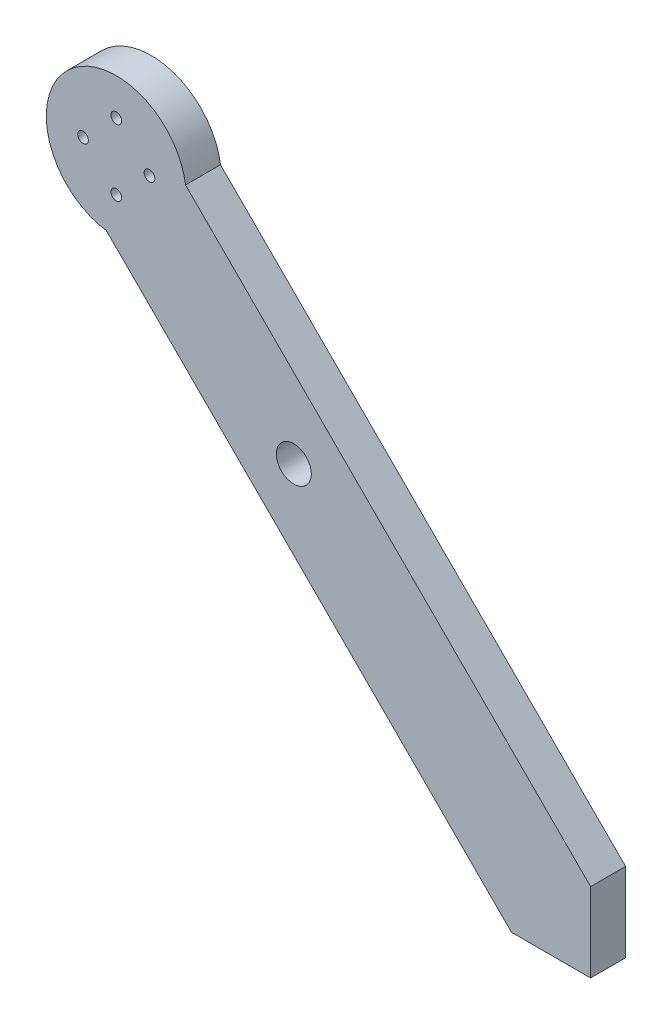
ISO-10303-21;
HEADER;
FILE_DESCRIPTION(('STEP AP214'),'2;1');
FILE_NAME('part.step','',(''),(''),'','','');
FILE_SCHEMA(('AUTOMOTIVE_DESIGN { 1 0 10303 214 1 1 1 1 }'));
ENDSEC;
DATA;
#1=APPLICATION_CONTEXT('core data for automotive mechanical design processes');
#2=APPLICATION_PROTOCOL_DEFINITION('international standard','automotive_design',2000,#1);
#3=PRODUCT_CONTEXT('',#1,'mechanical');
#4=PRODUCT('Part','Part','',(#3));
#5=PRODUCT_RELATED_PRODUCT_CATEGORY('part','',(#4));
#6=PRODUCT_DEFINITION_FORMATION('','',#4);
#7=PRODUCT_DEFINITION_CONTEXT('part definition',#1,'design');
#8=PRODUCT_DEFINITION('design','',#6,#7);
#9=PRODUCT_DEFINITION_SHAPE('','',#8);
#10=(LENGTH_UNIT() NAMED_UNIT(*) SI_UNIT(.MILLI.,.METRE.));
#11=(NAMED_UNIT(*) PLANE_ANGLE_UNIT() SI_UNIT($,.RADIAN.));
#12=(NAMED_UNIT(*) SI_UNIT($,.STERADIAN.) SOLID_ANGLE_UNIT());
#13=UNCERTAINTY_MEASURE_WITH_UNIT(LENGTH_MEASURE(1.E-05),#10,'distance_accuracy_value','');
#14=(GEOMETRIC_REPRESENTATION_CONTEXT(3) GLOBAL_UNCERTAINTY_ASSIGNED_CONTEXT((#13)) GLOBAL_UNIT_ASSIGNED_CONTEXT((#10,
#11,#12)) REPRESENTATION_CONTEXT('',''));
#15=CARTESIAN_POINT('',(0.,0.,0.));
#16=DIRECTION('',(0.,0.,1.));
#17=DIRECTION('',(1.,0.,0.));
#18=AXIS2_PLACEMENT_3D('',#15,#16,#17);
#19=CARTESIAN_POINT('',(-135.610173055266,135.610173055266,10.));
#20=DIRECTION('',(0.,0.,-1.));
#21=DIRECTION('',(-1.,0.,0.));
#22=AXIS2_PLACEMENT_3D('',#19,#20,#21);
#23=CYLINDRICAL_SURFACE('',#22,20.);
#24=CARTESIAN_POINT('',(-135.610173055266,135.610173055266,0.));
#25=DIRECTION('',(0.,0.,1.));
#26=DIRECTION('',(1.,0.,0.));
#27=AXIS2_PLACEMENT_3D('',#24,#25,#26);
#28=CIRCLE('',#27,20.);
#29=CARTESIAN_POINT('',(-115.811183182043,138.438600180013,0.));
#30=VERTEX_POINT('',#29);
#31=CARTESIAN_POINT('',(-138.438600180013,115.811183182043,0.));
#32=VERTEX_POINT('',#31);
#33=EDGE_CURVE('E112',#30,#32,#28,.T.);
#34=ORIENTED_EDGE('',*,*,#33,.T.);
#35=DIRECTION('',(0.,0.,-1.));
#36=VECTOR('',#35,1.);
#37=CARTESIAN_POINT('',(-138.438600180013,115.811183182043,10.));
#38=LINE('',#37,#36);
#39=CARTESIAN_POINT('',(-138.438600180013,115.811183182043,10.));
#40=VERTEX_POINT('',#39);
#41=EDGE_CURVE('E125',#40,#32,#38,.T.);
#42=ORIENTED_EDGE('',*,*,#41,.F.);
#43=CARTESIAN_POINT('',(-135.610173055266,135.610173055266,10.));
#44=DIRECTION('',(0.,0.,1.));
#45=DIRECTION('',(1.,0.,0.));
#46=AXIS2_PLACEMENT_3D('',#43,#44,#45);
#47=CIRCLE('',#46,20.);
#48=CARTESIAN_POINT('',(-115.811183182043,138.438600180013,10.));
#49=VERTEX_POINT('',#48);
#50=EDGE_CURVE('E121',#49,#40,#47,.T.);
#51=ORIENTED_EDGE('',*,*,#50,.F.);
#52=DIRECTION('',(0.,0.,-1.));
#53=VECTOR('',#52,1.);
#54=CARTESIAN_POINT('',(-115.811183182043,138.438600180013,10.));
#55=LINE('',#54,#53);
#56=EDGE_CURVE('E108',#49,#30,#55,.T.);
#57=ORIENTED_EDGE('',*,*,#56,.T.);
#58=EDGE_LOOP('',(#34,#42,#51,#57));
#59=FACE_BOUND('',#58,.T.);
#60=ADVANCED_FACE('F36',(#59),#23,.T.);
#61=CARTESIAN_POINT('',(-11.3137084989847,-11.3137084989848,10.));
#62=DIRECTION('',(0.707106781186547,0.707106781186548,0.));
#63=DIRECTION('',(-0.707106781186548,0.707106781186547,0.));
#64=AXIS2_PLACEMENT_3D('',#61,#62,#63);
#65=PLANE('',#64);
#66=DIRECTION('',(0.707106781186548,-0.707106781186547,0.));
#67=VECTOR('',#66,1.);
#68=CARTESIAN_POINT('',(-11.3137084989847,-11.3137084989848,0.));
#69=LINE('',#68,#67);
#70=CARTESIAN_POINT('',(-22.6274169979694,0.,0.));
#71=VERTEX_POINT('',#70);
#72=EDGE_CURVE('E115',#32,#71,#69,.T.);
#73=ORIENTED_EDGE('',*,*,#72,.T.);
#74=DIRECTION('',(0.,0.,-1.));
#75=VECTOR('',#74,1.);
#76=CARTESIAN_POINT('',(-22.6274169979694,0.,10.));
#77=LINE('',#76,#75);
#78=CARTESIAN_POINT('',(-22.6274169979694,0.,10.));
#79=VERTEX_POINT('',#78);
#80=EDGE_CURVE('E103',#79,#71,#77,.T.);
#81=ORIENTED_EDGE('',*,*,#80,.F.);
#82=DIRECTION('',(0.707106781186548,-0.707106781186547,0.));
#83=VECTOR('',#82,1.);
#84=CARTESIAN_POINT('',(-11.3137084989847,-11.3137084989848,10.));
#85=LINE('',#84,#83);
#86=EDGE_CURVE('E87',#40,#79,#85,.T.);
#87=ORIENTED_EDGE('',*,*,#86,.F.);
#88=ORIENTED_EDGE('',*,*,#41,.T.);
#89=EDGE_LOOP('',(#73,#81,#87,#88));
#90=FACE_BOUND('',#89,.T.);
#91=ADVANCED_FACE('F151',(#90),#65,.F.);
#92=CARTESIAN_POINT('',(0.,0.,10.));
#93=DIRECTION('',(0.,1.,0.));
#94=DIRECTION('',(-1.,0.,0.));
#95=AXIS2_PLACEMENT_3D('',#92,#93,#94);
#96=PLANE('',#95);
#97=DIRECTION('',(1.,0.,0.));
#98=VECTOR('',#97,1.);
#99=CARTESIAN_POINT('',(0.,0.,0.));
#100=LINE('',#99,#98);
#101=CARTESIAN_POINT('',(0.,0.,0.));
#102=VERTEX_POINT('',#101);
#103=EDGE_CURVE('E102',#71,#102,#100,.T.);
#104=ORIENTED_EDGE('',*,*,#103,.T.);
#105=DIRECTION('',(0.,0.,-1.));
#106=VECTOR('',#105,1.);
#107=CARTESIAN_POINT('',(0.,0.,10.));
#108=LINE('',#107,#106);
#109=CARTESIAN_POINT('',(0.,0.,10.));
#110=VERTEX_POINT('',#109);
#111=EDGE_CURVE('E99',#110,#102,#108,.T.);
#112=ORIENTED_EDGE('',*,*,#111,.F.);
#113=DIRECTION('',(1.,0.,0.));
#114=VECTOR('',#113,1.);
#115=CARTESIAN_POINT('',(0.,0.,10.));
#116=LINE('',#115,#114);
#117=EDGE_CURVE('E91',#79,#110,#116,.T.);
#118=ORIENTED_EDGE('',*,*,#117,.F.);
#119=ORIENTED_EDGE('',*,*,#80,.T.);
#120=EDGE_LOOP('',(#104,#112,#118,#119));
#121=FACE_BOUND('',#120,.T.);
#122=ADVANCED_FACE('F100',(#121),#96,.F.);
#123=CARTESIAN_POINT('',(0.,0.,10.));
#124=DIRECTION('',(-1.,0.,0.));
#125=DIRECTION('',(0.,-1.,0.));
#126=AXIS2_PLACEMENT_3D('',#123,#124,#125);
#127=PLANE('',#126);
#128=DIRECTION('',(0.,1.,0.));
#129=VECTOR('',#128,1.);
#130=CARTESIAN_POINT('',(0.,0.,0.));
#131=LINE('',#130,#129);
#132=CARTESIAN_POINT('',(0.,22.6274169979696,0.));
#133=VERTEX_POINT('',#132);
#134=EDGE_CURVE('E72',#102,#133,#131,.T.);
#135=ORIENTED_EDGE('',*,*,#134,.T.);
#136=DIRECTION('',(0.,0.,-1.));
#137=VECTOR('',#136,1.);
#138=CARTESIAN_POINT('',(0.,22.6274169979696,10.));
#139=LINE('',#138,#137);
#140=CARTESIAN_POINT('',(0.,22.6274169979696,10.));
#141=VERTEX_POINT('',#140);
#142=EDGE_CURVE('E104',#141,#133,#139,.T.);
#143=ORIENTED_EDGE('',*,*,#142,.F.);
#144=DIRECTION('',(0.,1.,0.));
#145=VECTOR('',#144,1.);
#146=CARTESIAN_POINT('',(0.,0.,10.));
#147=LINE('',#146,#145);
#148=EDGE_CURVE('E95',#110,#141,#147,.T.);
#149=ORIENTED_EDGE('',*,*,#148,.F.);
#150=ORIENTED_EDGE('',*,*,#111,.T.);
#151=EDGE_LOOP('',(#135,#143,#149,#150));
#152=FACE_BOUND('',#151,.T.);
#153=ADVANCED_FACE('F106',(#152),#127,.F.);
#154=CARTESIAN_POINT('',(11.3137084989848,11.3137084989848,10.));
#155=DIRECTION('',(-0.707106781186547,-0.707106781186548,0.));
#156=DIRECTION('',(0.707106781186548,-0.707106781186547,0.));
#157=AXIS2_PLACEMENT_3D('',#154,#155,#156);
#158=PLANE('',#157);
#159=DIRECTION('',(-0.707106781186548,0.707106781186547,0.));
#160=VECTOR('',#159,1.);
#161=CARTESIAN_POINT('',(11.3137084989848,11.3137084989848,0.));
#162=LINE('',#161,#160);
#163=EDGE_CURVE('E78',#133,#30,#162,.T.);
#164=ORIENTED_EDGE('',*,*,#163,.T.);
#165=ORIENTED_EDGE('',*,*,#56,.F.);
#166=DIRECTION('',(-0.707106781186548,0.707106781186547,0.));
#167=VECTOR('',#166,1.);
#168=CARTESIAN_POINT('',(11.3137084989848,11.3137084989848,10.));
#169=LINE('',#168,#167);
#170=EDGE_CURVE('E52',#141,#49,#169,.T.);
#171=ORIENTED_EDGE('',*,*,#170,.F.);
#172=ORIENTED_EDGE('',*,*,#142,.T.);
#173=EDGE_LOOP('',(#164,#165,#171,#172));
#174=FACE_BOUND('',#173,.T.);
#175=ADVANCED_FACE('F140',(#174),#158,.F.);
#176=CARTESIAN_POINT('',(0.,0.,10.));
#177=DIRECTION('',(0.,0.,1.));
#178=DIRECTION('',(1.,0.,0.));
#179=AXIS2_PLACEMENT_3D('',#176,#177,#178);
#180=PLANE('',#179);
#181=CARTESIAN_POINT('',(-135.610173055266,145.110173055266,10.));
#182=DIRECTION('',(0.,0.,-1.));
#183=DIRECTION('',(-1.,0.,0.));
#184=AXIS2_PLACEMENT_3D('',#181,#182,#183);
#185=CIRCLE('',#184,1.52500000000001);
#186=CARTESIAN_POINT('',(-137.135173055266,145.110173055266,10.));
#187=VERTEX_POINT('',#186);
#188=EDGE_CURVE('E280',#187,#187,#185,.T.);
#189=ORIENTED_EDGE('',*,*,#188,.T.);
#190=EDGE_LOOP('',(#189));
#191=FACE_BOUND('',#190,.T.);
#192=CARTESIAN_POINT('',(-145.110173055267,135.610173055267,10.));
#193=DIRECTION('',(0.,0.,-1.));
#194=DIRECTION('',(-1.,0.,0.));
#195=AXIS2_PLACEMENT_3D('',#192,#193,#194);
#196=CIRCLE('',#195,1.52500000000001);
#197=CARTESIAN_POINT('',(-146.635173055267,135.610173055267,10.));
#198=VERTEX_POINT('',#197);
#199=EDGE_CURVE('E284',#198,#198,#196,.T.);
#200=ORIENTED_EDGE('',*,*,#199,.T.);
#201=EDGE_LOOP('',(#200));
#202=FACE_BOUND('',#201,.T.);
#203=CARTESIAN_POINT('',(-135.610173055266,126.110173055266,10.));
#204=DIRECTION('',(0.,0.,-1.));
#205=DIRECTION('',(-1.,0.,0.));
#206=AXIS2_PLACEMENT_3D('',#203,#204,#205);
#207=CIRCLE('',#206,1.52500000000001);
#208=CARTESIAN_POINT('',(-137.135173055266,126.110173055266,10.));
#209=VERTEX_POINT('',#208);
#210=EDGE_CURVE('E294',#209,#209,#207,.T.);
#211=ORIENTED_EDGE('',*,*,#210,.T.);
#212=EDGE_LOOP('',(#211));
#213=FACE_BOUND('',#212,.T.);
#214=CARTESIAN_POINT('',(-126.110173055266,135.610173055266,10.));
#215=DIRECTION('',(0.,0.,-1.));
#216=DIRECTION('',(-1.,0.,0.));
#217=AXIS2_PLACEMENT_3D('',#214,#215,#216);
#218=CIRCLE('',#217,1.52500000000001);
#219=CARTESIAN_POINT('',(-127.635173055266,135.610173055266,10.));
#220=VERTEX_POINT('',#219);
#221=EDGE_CURVE('E300',#220,#220,#218,.T.);
#222=ORIENTED_EDGE('',*,*,#221,.T.);
#223=EDGE_LOOP('',(#222));
#224=FACE_BOUND('',#223,.T.);
#225=CARTESIAN_POINT('',(-84.8528137423864,84.852813742385,10.));
#226=DIRECTION('',(0.,0.,-1.));
#227=DIRECTION('',(-1.,0.,0.));
#228=AXIS2_PLACEMENT_3D('',#225,#226,#227);
#229=CIRCLE('',#228,4.99999999999986);
#230=CARTESIAN_POINT('',(-89.8528137423863,84.852813742385,10.));
#231=VERTEX_POINT('',#230);
#232=EDGE_CURVE('E306',#231,#231,#229,.T.);
#233=ORIENTED_EDGE('',*,*,#232,.T.);
#234=EDGE_LOOP('',(#233));
#235=FACE_BOUND('',#234,.T.);
#236=ORIENTED_EDGE('',*,*,#50,.T.);
#237=ORIENTED_EDGE('',*,*,#86,.T.);
#238=ORIENTED_EDGE('',*,*,#117,.T.);
#239=ORIENTED_EDGE('',*,*,#148,.T.);
#240=ORIENTED_EDGE('',*,*,#170,.T.);
#241=EDGE_LOOP('',(#236,#237,#238,#239,#240));
#242=FACE_BOUND('',#241,.T.);
#243=ADVANCED_FACE('F93',(#191,#202,#213,#224,#235,#242),#180,.T.);
#244=CARTESIAN_POINT('',(0.,0.,0.));
#245=DIRECTION('',(0.,0.,1.));
#246=DIRECTION('',(1.,0.,0.));
#247=AXIS2_PLACEMENT_3D('',#244,#245,#246);
#248=PLANE('',#247);
#249=CARTESIAN_POINT('',(-135.610173055266,145.110173055266,0.));
#250=DIRECTION('',(0.,0.,-1.));
#251=DIRECTION('',(-1.,0.,0.));
#252=AXIS2_PLACEMENT_3D('',#249,#250,#251);
#253=CIRCLE('',#252,1.52500000000001);
#254=CARTESIAN_POINT('',(-137.135173055266,145.110173055266,0.));
#255=VERTEX_POINT('',#254);
#256=EDGE_CURVE('E283',#255,#255,#253,.T.);
#257=ORIENTED_EDGE('',*,*,#256,.F.);
#258=EDGE_LOOP('',(#257));
#259=FACE_BOUND('',#258,.T.);
#260=CARTESIAN_POINT('',(-145.110173055267,135.610173055267,0.));
#261=DIRECTION('',(0.,0.,-1.));
#262=DIRECTION('',(-1.,0.,0.));
#263=AXIS2_PLACEMENT_3D('',#260,#261,#262);
#264=CIRCLE('',#263,1.52500000000001);
#265=CARTESIAN_POINT('',(-146.635173055267,135.610173055267,0.));
#266=VERTEX_POINT('',#265);
#267=EDGE_CURVE('E289',#266,#266,#264,.T.);
#268=ORIENTED_EDGE('',*,*,#267,.F.);
#269=EDGE_LOOP('',(#268));
#270=FACE_BOUND('',#269,.T.);
#271=CARTESIAN_POINT('',(-135.610173055266,126.110173055266,0.));
#272=DIRECTION('',(0.,0.,-1.));
#273=DIRECTION('',(-1.,0.,0.));
#274=AXIS2_PLACEMENT_3D('',#271,#272,#273);
#275=CIRCLE('',#274,1.52500000000001);
#276=CARTESIAN_POINT('',(-137.135173055266,126.110173055266,0.));
#277=VERTEX_POINT('',#276);
#278=EDGE_CURVE('E297',#277,#277,#275,.T.);
#279=ORIENTED_EDGE('',*,*,#278,.F.);
#280=EDGE_LOOP('',(#279));
#281=FACE_BOUND('',#280,.T.);
#282=CARTESIAN_POINT('',(-126.110173055266,135.610173055266,0.));
#283=DIRECTION('',(0.,0.,-1.));
#284=DIRECTION('',(-1.,0.,0.));
#285=AXIS2_PLACEMENT_3D('',#282,#283,#284);
#286=CIRCLE('',#285,1.52500000000001);
#287=CARTESIAN_POINT('',(-127.635173055266,135.610173055266,0.));
#288=VERTEX_POINT('',#287);
#289=EDGE_CURVE('E303',#288,#288,#286,.T.);
#290=ORIENTED_EDGE('',*,*,#289,.F.);
#291=EDGE_LOOP('',(#290));
#292=FACE_BOUND('',#291,.T.);
#293=CARTESIAN_POINT('',(-84.8528137423864,84.852813742385,0.));
#294=DIRECTION('',(0.,0.,-1.));
#295=DIRECTION('',(-1.,0.,0.));
#296=AXIS2_PLACEMENT_3D('',#293,#294,#295);
#297=CIRCLE('',#296,4.99999999999986);
#298=CARTESIAN_POINT('',(-89.8528137423863,84.852813742385,0.));
#299=VERTEX_POINT('',#298);
#300=EDGE_CURVE('E309',#299,#299,#297,.T.);
#301=ORIENTED_EDGE('',*,*,#300,.F.);
#302=EDGE_LOOP('',(#301));
#303=FACE_BOUND('',#302,.T.);
#304=CARTESIAN_POINT('',(-14.1421356237309,14.142135623731,0.));
#305=DIRECTION('',(0.,0.,1.));
#306=DIRECTION('',(1.,0.,0.));
#307=AXIS2_PLACEMENT_3D('',#304,#305,#306);
#308=CIRCLE('',#307,4.5);
#309=CARTESIAN_POINT('',(-9.64213562373094,14.142135623731,0.));
#310=VERTEX_POINT('',#309);
#311=EDGE_CURVE('E11',#310,#310,#308,.F.);
#312=ORIENTED_EDGE('',*,*,#311,.F.);
#313=EDGE_LOOP('',(#312));
#314=FACE_BOUND('',#313,.T.);
#315=CARTESIAN_POINT('',(-31.8198051533946,31.8198051533946,0.));
#316=DIRECTION('',(0.,0.,1.));
#317=DIRECTION('',(1.,0.,0.));
#318=AXIS2_PLACEMENT_3D('',#315,#316,#317);
#319=CIRCLE('',#318,4.5);
#320=CARTESIAN_POINT('',(-27.3198051533946,31.8198051533946,0.));
#321=VERTEX_POINT('',#320);
#322=EDGE_CURVE('E44',#321,#321,#319,.F.);
#323=ORIENTED_EDGE('',*,*,#322,.F.);
#324=EDGE_LOOP('',(#323));
#325=FACE_BOUND('',#324,.T.);
#326=ORIENTED_EDGE('',*,*,#33,.F.);
#327=ORIENTED_EDGE('',*,*,#163,.F.);
#328=ORIENTED_EDGE('',*,*,#134,.F.);
#329=ORIENTED_EDGE('',*,*,#103,.F.);
#330=ORIENTED_EDGE('',*,*,#72,.F.);
#331=EDGE_LOOP('',(#326,#327,#328,#329,#330));
#332=FACE_BOUND('',#331,.T.);
#333=ADVANCED_FACE('F131',(#259,#270,#281,#292,#303,#314,#325,#332),#248,.F.);
#334=CARTESIAN_POINT('',(-31.8198051533946,31.8198051533946,-17.7279220613579));
#335=DIRECTION('',(0.,0.,1.));
#336=DIRECTION('',(1.,0.,0.));
#337=AXIS2_PLACEMENT_3D('',#334,#335,#336);
#338=CYLINDRICAL_SURFACE('',#337,4.5);
#339=CARTESIAN_POINT('',(-31.8198051533946,31.8198051533946,-5.));
#340=DIRECTION('',(0.,0.,1.));
#341=DIRECTION('',(1.,0.,0.));
#342=AXIS2_PLACEMENT_3D('',#339,#340,#341);
#343=CIRCLE('',#342,4.5);
#344=CARTESIAN_POINT('',(-27.3198051533946,31.8198051533946,-5.));
#345=VERTEX_POINT('',#344);
#346=EDGE_CURVE('E116',#345,#345,#343,.T.);
#347=ORIENTED_EDGE('',*,*,#346,.T.);
#348=EDGE_LOOP('',(#347));
#349=FACE_BOUND('',#348,.T.);
#350=ORIENTED_EDGE('',*,*,#322,.T.);
#351=EDGE_LOOP('',(#350));
#352=FACE_BOUND('',#351,.T.);
#353=ADVANCED_FACE('F129',(#349,#352),#338,.T.);
#354=CARTESIAN_POINT('',(0.,0.,-5.));
#355=DIRECTION('',(0.,0.,1.));
#356=DIRECTION('',(1.,0.,0.));
#357=AXIS2_PLACEMENT_3D('',#354,#355,#356);
#358=PLANE('',#357);
#359=ORIENTED_EDGE('',*,*,#346,.F.);
#360=EDGE_LOOP('',(#359));
#361=FACE_BOUND('',#360,.T.);
#362=ADVANCED_FACE('F180',(#361),#358,.F.);
#363=CARTESIAN_POINT('',(-14.1421356237309,14.142135623731,-17.7279220613579));
#364=DIRECTION('',(0.,0.,1.));
#365=DIRECTION('',(1.,0.,0.));
#366=AXIS2_PLACEMENT_3D('',#363,#364,#365);
#367=CYLINDRICAL_SURFACE('',#366,4.5);
#368=CARTESIAN_POINT('',(-14.1421356237309,14.142135623731,-5.));
#369=DIRECTION('',(0.,0.,1.));
#370=DIRECTION('',(1.,0.,0.));
#371=AXIS2_PLACEMENT_3D('',#368,#369,#370);
#372=CIRCLE('',#371,4.5);
#373=CARTESIAN_POINT('',(-9.64213562373094,14.142135623731,-5.));
#374=VERTEX_POINT('',#373);
#375=EDGE_CURVE('E286',#374,#374,#372,.T.);
#376=ORIENTED_EDGE('',*,*,#375,.T.);
#377=EDGE_LOOP('',(#376));
#378=FACE_BOUND('',#377,.T.);
#379=ORIENTED_EDGE('',*,*,#311,.T.);
#380=EDGE_LOOP('',(#379));
#381=FACE_BOUND('',#380,.T.);
#382=ADVANCED_FACE('F191',(#378,#381),#367,.T.);
#383=CARTESIAN_POINT('',(0.,0.,-5.));
#384=DIRECTION('',(0.,0.,1.));
#385=DIRECTION('',(1.,0.,0.));
#386=AXIS2_PLACEMENT_3D('',#383,#384,#385);
#387=PLANE('',#386);
#388=ORIENTED_EDGE('',*,*,#375,.F.);
#389=EDGE_LOOP('',(#388));
#390=FACE_BOUND('',#389,.T.);
#391=ADVANCED_FACE('F201',(#390),#387,.F.);
#392=CARTESIAN_POINT('',(-84.8528137423864,84.852813742385,10.));
#393=DIRECTION('',(0.,0.,-1.));
#394=DIRECTION('',(-1.,0.,0.));
#395=AXIS2_PLACEMENT_3D('',#392,#393,#394);
#396=CYLINDRICAL_SURFACE('',#395,4.99999999999986);
#397=ORIENTED_EDGE('',*,*,#232,.F.);
#398=EDGE_LOOP('',(#397));
#399=FACE_BOUND('',#398,.T.);
#400=ORIENTED_EDGE('',*,*,#300,.T.);
#401=EDGE_LOOP('',(#400));
#402=FACE_BOUND('',#401,.T.);
#403=ADVANCED_FACE('F211',(#399,#402),#396,.F.);
#404=CARTESIAN_POINT('',(-126.110173055266,135.610173055266,10.));
#405=DIRECTION('',(0.,0.,-1.));
#406=DIRECTION('',(-1.,0.,0.));
#407=AXIS2_PLACEMENT_3D('',#404,#405,#406);
#408=CYLINDRICAL_SURFACE('',#407,1.52500000000001);
#409=ORIENTED_EDGE('',*,*,#221,.F.);
#410=EDGE_LOOP('',(#409));
#411=FACE_BOUND('',#410,.T.);
#412=ORIENTED_EDGE('',*,*,#289,.T.);
#413=EDGE_LOOP('',(#412));
#414=FACE_BOUND('',#413,.T.);
#415=ADVANCED_FACE('F233',(#411,#414),#408,.F.);
#416=CARTESIAN_POINT('',(-135.610173055266,126.110173055266,10.));
#417=DIRECTION('',(0.,0.,-1.));
#418=DIRECTION('',(-1.,0.,0.));
#419=AXIS2_PLACEMENT_3D('',#416,#417,#418);
#420=CYLINDRICAL_SURFACE('',#419,1.52500000000001);
#421=ORIENTED_EDGE('',*,*,#210,.F.);
#422=EDGE_LOOP('',(#421));
#423=FACE_BOUND('',#422,.T.);
#424=ORIENTED_EDGE('',*,*,#278,.T.);
#425=EDGE_LOOP('',(#424));
#426=FACE_BOUND('',#425,.T.);
#427=ADVANCED_FACE('F243',(#423,#426),#420,.F.);
#428=CARTESIAN_POINT('',(-145.110173055267,135.610173055267,10.));
#429=DIRECTION('',(0.,0.,-1.));
#430=DIRECTION('',(-1.,0.,0.));
#431=AXIS2_PLACEMENT_3D('',#428,#429,#430);
#432=CYLINDRICAL_SURFACE('',#431,1.52500000000001);
#433=ORIENTED_EDGE('',*,*,#199,.F.);
#434=EDGE_LOOP('',(#433));
#435=FACE_BOUND('',#434,.T.);
#436=ORIENTED_EDGE('',*,*,#267,.T.);
#437=EDGE_LOOP('',(#436));
#438=FACE_BOUND('',#437,.T.);
#439=ADVANCED_FACE('F253',(#435,#438),#432,.F.);
#440=CARTESIAN_POINT('',(-135.610173055266,145.110173055266,10.));
#441=DIRECTION('',(0.,0.,-1.));
#442=DIRECTION('',(-1.,0.,0.));
#443=AXIS2_PLACEMENT_3D('',#440,#441,#442);
#444=CYLINDRICAL_SURFACE('',#443,1.52500000000001);
#445=ORIENTED_EDGE('',*,*,#188,.F.);
#446=EDGE_LOOP('',(#445));
#447=FACE_BOUND('',#446,.T.);
#448=ORIENTED_EDGE('',*,*,#256,.T.);
#449=EDGE_LOOP('',(#448));
#450=FACE_BOUND('',#449,.T.);
#451=ADVANCED_FACE('F263',(#447,#450),#444,.F.);
#452=CLOSED_SHELL('',(#60,#91,#122,#153,#175,#243,#333,#353,#362,#382,#391,#403,#415,#427,#439,#451));
#453=MANIFOLD_SOLID_BREP('B2',#452);
#454=ADVANCED_BREP_SHAPE_REPRESENTATION('',(#18,#453),#14);
#455=SHAPE_DEFINITION_REPRESENTATION(#9,#454);
ENDSEC;
END-ISO-10303-21;
